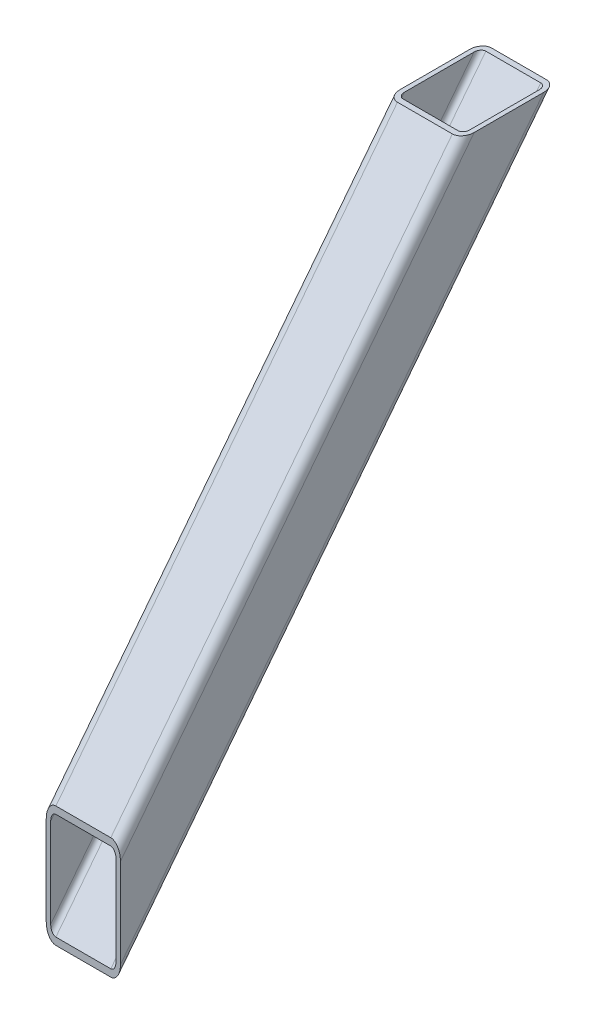
ISO-10303-21;
HEADER;
FILE_DESCRIPTION(('STEP AP214'),'2;1');
FILE_NAME('part.step','',(''),(''),'','','');
FILE_SCHEMA(('AUTOMOTIVE_DESIGN { 1 0 10303 214 1 1 1 1 }'));
ENDSEC;
DATA;
#1=APPLICATION_CONTEXT('core data for automotive mechanical design processes');
#2=APPLICATION_PROTOCOL_DEFINITION('international standard','automotive_design',2000,#1);
#3=PRODUCT_CONTEXT('',#1,'mechanical');
#4=PRODUCT('Part','Part','',(#3));
#5=PRODUCT_RELATED_PRODUCT_CATEGORY('part','',(#4));
#6=PRODUCT_DEFINITION_FORMATION('','',#4);
#7=PRODUCT_DEFINITION_CONTEXT('part definition',#1,'design');
#8=PRODUCT_DEFINITION('design','',#6,#7);
#9=PRODUCT_DEFINITION_SHAPE('','',#8);
#10=(LENGTH_UNIT() NAMED_UNIT(*) SI_UNIT(.MILLI.,.METRE.));
#11=(NAMED_UNIT(*) PLANE_ANGLE_UNIT() SI_UNIT($,.RADIAN.));
#12=(NAMED_UNIT(*) SI_UNIT($,.STERADIAN.) SOLID_ANGLE_UNIT());
#13=UNCERTAINTY_MEASURE_WITH_UNIT(LENGTH_MEASURE(1.E-05),#10,'distance_accuracy_value','');
#14=(GEOMETRIC_REPRESENTATION_CONTEXT(3) GLOBAL_UNCERTAINTY_ASSIGNED_CONTEXT((#13)) GLOBAL_UNIT_ASSIGNED_CONTEXT((#10,
#11,#12)) REPRESENTATION_CONTEXT('',''));
#15=CARTESIAN_POINT('',(0.,0.,0.));
#16=DIRECTION('',(0.,0.,1.));
#17=DIRECTION('',(1.,0.,0.));
#18=AXIS2_PLACEMENT_3D('',#15,#16,#17);
#19=CARTESIAN_POINT('',(22.5000000000001,344.,-266.521245599452));
#20=DIRECTION('',(0.,-1.,0.));
#21=DIRECTION('',(0.,0.,-1.));
#22=AXIS2_PLACEMENT_3D('',#19,#20,#21);
#23=PLANE('',#22);
#24=DIRECTION('',(0.,0.,1.));
#25=VECTOR('',#24,1.);
#26=CARTESIAN_POINT('',(22.,344.,14.597399852797));
#27=LINE('',#26,#25);
#28=CARTESIAN_POINT('',(22.,344.,-291.274527794179));
#29=VERTEX_POINT('',#28);
#30=CARTESIAN_POINT('',(22.,344.,-244.382615062964));
#31=VERTEX_POINT('',#30);
#32=EDGE_CURVE('E183',#29,#31,#27,.T.);
#33=ORIENTED_EDGE('',*,*,#32,.T.);
#34=CARTESIAN_POINT('',(18.5,344.,-244.382615062964));
#35=DIRECTION('',(0.,-1.,0.));
#36=DIRECTION('',(0.,0.,-1.));
#37=AXIS2_PLACEMENT_3D('',#34,#35,#36);
#38=ELLIPSE('',#37,4.43572147457432,3.49999999999998);
#39=CARTESIAN_POINT('',(18.5,344.,-239.94689358839));
#40=VERTEX_POINT('',#39);
#41=EDGE_CURVE('E282',#31,#40,#38,.T.);
#42=ORIENTED_EDGE('',*,*,#41,.T.);
#43=DIRECTION('',(-1.,0.,0.));
#44=VECTOR('',#43,1.);
#45=CARTESIAN_POINT('',(18.5,344.,-239.94689358839));
#46=LINE('',#45,#44);
#47=CARTESIAN_POINT('',(-18.5,344.,-239.94689358839));
#48=VERTEX_POINT('',#47);
#49=EDGE_CURVE('E278',#40,#48,#46,.T.);
#50=ORIENTED_EDGE('',*,*,#49,.T.);
#51=CARTESIAN_POINT('',(-18.5,344.,-244.382615062964));
#52=DIRECTION('',(0.,-1.,0.));
#53=DIRECTION('',(0.,0.,-1.));
#54=AXIS2_PLACEMENT_3D('',#51,#52,#53);
#55=ELLIPSE('',#54,4.43572147457432,3.49999999999998);
#56=CARTESIAN_POINT('',(-22.,344.,-244.382615062964));
#57=VERTEX_POINT('',#56);
#58=EDGE_CURVE('E279',#48,#57,#55,.T.);
#59=ORIENTED_EDGE('',*,*,#58,.T.);
#60=DIRECTION('',(0.,0.,-1.));
#61=VECTOR('',#60,1.);
#62=CARTESIAN_POINT('',(-22.0000000000001,344.,-14.597399852797));
#63=LINE('',#62,#61);
#64=CARTESIAN_POINT('',(-22.,344.,-291.274527794179));
#65=VERTEX_POINT('',#64);
#66=EDGE_CURVE('E185',#57,#65,#63,.T.);
#67=ORIENTED_EDGE('',*,*,#66,.T.);
#68=CARTESIAN_POINT('',(-18.5,344.,-291.274527794179));
#69=DIRECTION('',(0.,-1.,0.));
#70=DIRECTION('',(0.,0.,-1.));
#71=AXIS2_PLACEMENT_3D('',#68,#69,#70);
#72=ELLIPSE('',#71,4.43572147457432,3.49999999999998);
#73=CARTESIAN_POINT('',(-18.5,344.,-295.710249268753));
#74=VERTEX_POINT('',#73);
#75=EDGE_CURVE('E189',#65,#74,#72,.T.);
#76=ORIENTED_EDGE('',*,*,#75,.T.);
#77=DIRECTION('',(1.,0.,0.));
#78=VECTOR('',#77,1.);
#79=CARTESIAN_POINT('',(18.5,344.,-295.710249268753));
#80=LINE('',#79,#78);
#81=CARTESIAN_POINT('',(18.5,344.,-295.710249268753));
#82=VERTEX_POINT('',#81);
#83=EDGE_CURVE('E76',#74,#82,#80,.T.);
#84=ORIENTED_EDGE('',*,*,#83,.T.);
#85=CARTESIAN_POINT('',(18.5,344.,-291.274527794179));
#86=DIRECTION('',(0.,-1.,0.));
#87=DIRECTION('',(0.,0.,-1.));
#88=AXIS2_PLACEMENT_3D('',#85,#86,#87);
#89=ELLIPSE('',#88,4.43572147457432,3.49999999999998);
#90=EDGE_CURVE('E13',#82,#29,#89,.T.);
#91=ORIENTED_EDGE('',*,*,#90,.T.);
#92=EDGE_LOOP('',(#33,#42,#50,#59,#67,#76,#84,#91));
#93=FACE_BOUND('',#92,.T.);
#94=CARTESIAN_POINT('',(18.5000000000001,344.,-244.382615062964));
#95=DIRECTION('',(0.,-1.,0.));
#96=DIRECTION('',(0.,0.,-1.));
#97=AXIS2_PLACEMENT_3D('',#94,#95,#96);
#98=ELLIPSE('',#97,8.23776845278092,6.5);
#99=CARTESIAN_POINT('',(25.0000000000001,344.,-244.382615062964));
#100=VERTEX_POINT('',#99);
#101=CARTESIAN_POINT('',(18.5,344.,-236.144846610183));
#102=VERTEX_POINT('',#101);
#103=EDGE_CURVE('E258',#100,#102,#98,.T.);
#104=ORIENTED_EDGE('',*,*,#103,.F.);
#105=DIRECTION('',(0.,0.,1.));
#106=VECTOR('',#105,1.);
#107=CARTESIAN_POINT('',(25.0000000000001,344.,14.597399852797));
#108=LINE('',#107,#106);
#109=CARTESIAN_POINT('',(25.0000000000001,344.,-291.274527794179));
#110=VERTEX_POINT('',#109);
#111=EDGE_CURVE('E201',#110,#100,#108,.T.);
#112=ORIENTED_EDGE('',*,*,#111,.F.);
#113=CARTESIAN_POINT('',(18.5000000000001,344.,-291.274527794179));
#114=DIRECTION('',(0.,-1.,0.));
#115=DIRECTION('',(0.,0.,-1.));
#116=AXIS2_PLACEMENT_3D('',#113,#114,#115);
#117=ELLIPSE('',#116,8.23776845278092,6.5);
#118=CARTESIAN_POINT('',(18.5,344.,-299.51229624696));
#119=VERTEX_POINT('',#118);
#120=EDGE_CURVE('E199',#119,#110,#117,.T.);
#121=ORIENTED_EDGE('',*,*,#120,.F.);
#122=DIRECTION('',(1.,0.,0.));
#123=VECTOR('',#122,1.);
#124=CARTESIAN_POINT('',(18.5,344.,-299.51229624696));
#125=LINE('',#124,#123);
#126=CARTESIAN_POINT('',(-18.4999999999999,344.,-299.51229624696));
#127=VERTEX_POINT('',#126);
#128=EDGE_CURVE('E195',#127,#119,#125,.T.);
#129=ORIENTED_EDGE('',*,*,#128,.F.);
#130=CARTESIAN_POINT('',(-18.5,344.,-291.274527794179));
#131=DIRECTION('',(0.,-1.,0.));
#132=DIRECTION('',(0.,0.,-1.));
#133=AXIS2_PLACEMENT_3D('',#130,#131,#132);
#134=ELLIPSE('',#133,8.23776845278092,6.5);
#135=CARTESIAN_POINT('',(-25.,344.,-291.274527794179));
#136=VERTEX_POINT('',#135);
#137=EDGE_CURVE('E193',#136,#127,#134,.T.);
#138=ORIENTED_EDGE('',*,*,#137,.F.);
#139=DIRECTION('',(0.,0.,-1.));
#140=VECTOR('',#139,1.);
#141=CARTESIAN_POINT('',(-25.,344.,-14.597399852797));
#142=LINE('',#141,#140);
#143=CARTESIAN_POINT('',(-25.,344.,-244.382615062964));
#144=VERTEX_POINT('',#143);
#145=EDGE_CURVE('E186',#144,#136,#142,.T.);
#146=ORIENTED_EDGE('',*,*,#145,.F.);
#147=CARTESIAN_POINT('',(-18.4999999999999,344.,-244.382615062964));
#148=DIRECTION('',(0.,-1.,0.));
#149=DIRECTION('',(0.,0.,-1.));
#150=AXIS2_PLACEMENT_3D('',#147,#148,#149);
#151=ELLIPSE('',#150,8.23776845278092,6.5);
#152=CARTESIAN_POINT('',(-18.4999999999999,344.,-236.144846610183));
#153=VERTEX_POINT('',#152);
#154=EDGE_CURVE('E275',#153,#144,#151,.T.);
#155=ORIENTED_EDGE('',*,*,#154,.F.);
#156=DIRECTION('',(-1.,0.,0.));
#157=VECTOR('',#156,1.);
#158=CARTESIAN_POINT('',(18.5,344.,-236.144846610183));
#159=LINE('',#158,#157);
#160=EDGE_CURVE('E265',#102,#153,#159,.T.);
#161=ORIENTED_EDGE('',*,*,#160,.F.);
#162=EDGE_LOOP('',(#104,#112,#121,#129,#138,#146,#155,#161));
#163=FACE_BOUND('',#162,.T.);
#164=ADVANCED_FACE('F66',(#93,#163),#23,.F.);
#165=CARTESIAN_POINT('',(-25.,-11.3651184568205,-14.597399852797));
#166=DIRECTION('',(1.,0.,0.));
#167=DIRECTION('',(0.,0.,-1.));
#168=AXIS2_PLACEMENT_3D('',#165,#166,#167);
#169=PLANE('',#168);
#170=DIRECTION('',(0.,0.789048640691729,-0.614330727395703));
#171=VECTOR('',#170,1.);
#172=CARTESIAN_POINT('',(-25.,-11.3651184568205,-14.597399852797));
#173=LINE('',#172,#171);
#174=CARTESIAN_POINT('',(-25.,-22.4076503778441,-6.));
#175=VERTEX_POINT('',#174);
#176=EDGE_CURVE('E85',#175,#136,#173,.T.);
#177=ORIENTED_EDGE('',*,*,#176,.F.);
#178=DIRECTION('',(0.,1.,0.));
#179=VECTOR('',#178,1.);
#180=CARTESIAN_POINT('',(-25.,-11.3651184568205,-6.));
#181=LINE('',#180,#179);
#182=CARTESIAN_POINT('',(-25.,37.8204944145413,-6.));
#183=VERTEX_POINT('',#182);
#184=EDGE_CURVE('E310',#175,#183,#181,.T.);
#185=ORIENTED_EDGE('',*,*,#184,.T.);
#186=DIRECTION('',(0.,0.789048640691729,-0.614330727395703));
#187=VECTOR('',#186,1.);
#188=CARTESIAN_POINT('',(-25.,11.3651184568205,14.597399852797));
#189=LINE('',#188,#187);
#190=EDGE_CURVE('E294',#183,#144,#189,.T.);
#191=ORIENTED_EDGE('',*,*,#190,.T.);
#192=ORIENTED_EDGE('',*,*,#145,.T.);
#193=EDGE_LOOP('',(#177,#185,#191,#192));
#194=FACE_BOUND('',#193,.T.);
#195=ADVANCED_FACE('F222',(#194),#169,.F.);
#196=CARTESIAN_POINT('',(-18.5,-11.3651184568205,-14.597399852797));
#197=DIRECTION('',(0.,0.789048640691729,-0.614330727395703));
#198=DIRECTION('',(0.,0.614330727395704,0.78904864069173));
#199=AXIS2_PLACEMENT_3D('',#196,#197,#198);
#200=CYLINDRICAL_SURFACE('',#199,6.5);
#201=DIRECTION('',(0.,0.789048640691729,-0.614330727395703));
#202=VECTOR('',#201,1.);
#203=CARTESIAN_POINT('',(-18.4999999999999,-15.3582681848926,-19.7262160172932));
#204=LINE('',#203,#202);
#205=CARTESIAN_POINT('',(-18.4999999999999,-32.988270408939,-6.));
#206=VERTEX_POINT('',#205);
#207=EDGE_CURVE('E198',#206,#127,#204,.T.);
#208=ORIENTED_EDGE('',*,*,#207,.F.);
#209=CARTESIAN_POINT('',(-18.5,-22.4076503778442,-6.));
#210=DIRECTION('',(0.,0.,-1.));
#211=DIRECTION('',(0.,1.,0.));
#212=AXIS2_PLACEMENT_3D('',#209,#210,#211);
#213=ELLIPSE('',#212,10.5806200310948,6.5);
#214=EDGE_CURVE('E312',#206,#175,#213,.T.);
#215=ORIENTED_EDGE('',*,*,#214,.T.);
#216=ORIENTED_EDGE('',*,*,#176,.T.);
#217=ORIENTED_EDGE('',*,*,#137,.T.);
#218=EDGE_LOOP('',(#208,#215,#216,#217));
#219=FACE_BOUND('',#218,.T.);
#220=ADVANCED_FACE('F227',(#219),#200,.T.);
#221=CARTESIAN_POINT('',(18.5,-15.3582681848926,-19.7262160172932));
#222=DIRECTION('',(0.,0.614330727395703,0.789048640691729));
#223=DIRECTION('',(0.,-0.78904864069173,0.614330727395704));
#224=AXIS2_PLACEMENT_3D('',#221,#222,#223);
#225=PLANE('',#224);
#226=DIRECTION('',(0.,0.789048640691729,-0.614330727395703));
#227=VECTOR('',#226,1.);
#228=CARTESIAN_POINT('',(18.5,-15.3582681848926,-19.7262160172932));
#229=LINE('',#228,#227);
#230=CARTESIAN_POINT('',(18.5,-32.988270408939,-6.));
#231=VERTEX_POINT('',#230);
#232=EDGE_CURVE('E98',#231,#119,#229,.T.);
#233=ORIENTED_EDGE('',*,*,#232,.F.);
#234=DIRECTION('',(-1.,0.,0.));
#235=VECTOR('',#234,1.);
#236=CARTESIAN_POINT('',(18.5,-32.988270408939,-6.));
#237=LINE('',#236,#235);
#238=EDGE_CURVE('E314',#231,#206,#237,.T.);
#239=ORIENTED_EDGE('',*,*,#238,.T.);
#240=ORIENTED_EDGE('',*,*,#207,.T.);
#241=ORIENTED_EDGE('',*,*,#128,.T.);
#242=EDGE_LOOP('',(#233,#239,#240,#241));
#243=FACE_BOUND('',#242,.T.);
#244=ADVANCED_FACE('F234',(#243),#225,.F.);
#245=CARTESIAN_POINT('',(18.5000000000001,-11.3651184568205,-14.597399852797));
#246=DIRECTION('',(0.,0.789048640691729,-0.614330727395703));
#247=DIRECTION('',(0.,0.614330727395704,0.78904864069173));
#248=AXIS2_PLACEMENT_3D('',#245,#246,#247);
#249=CYLINDRICAL_SURFACE('',#248,6.5);
#250=DIRECTION('',(0.,0.789048640691729,-0.614330727395703));
#251=VECTOR('',#250,1.);
#252=CARTESIAN_POINT('',(25.0000000000001,-11.3651184568205,-14.597399852797));
#253=LINE('',#252,#251);
#254=CARTESIAN_POINT('',(25.0000000000001,-22.4076503778441,-6.));
#255=VERTEX_POINT('',#254);
#256=EDGE_CURVE('E106',#255,#110,#253,.T.);
#257=ORIENTED_EDGE('',*,*,#256,.F.);
#258=CARTESIAN_POINT('',(18.5000000000001,-22.4076503778442,-6.));
#259=DIRECTION('',(0.,0.,-1.));
#260=DIRECTION('',(0.,1.,0.));
#261=AXIS2_PLACEMENT_3D('',#258,#259,#260);
#262=ELLIPSE('',#261,10.5806200310948,6.5);
#263=EDGE_CURVE('E317',#255,#231,#262,.T.);
#264=ORIENTED_EDGE('',*,*,#263,.T.);
#265=ORIENTED_EDGE('',*,*,#232,.T.);
#266=ORIENTED_EDGE('',*,*,#120,.T.);
#267=EDGE_LOOP('',(#257,#264,#265,#266));
#268=FACE_BOUND('',#267,.T.);
#269=ADVANCED_FACE('F237',(#268),#249,.T.);
#270=CARTESIAN_POINT('',(25.0000000000001,11.3651184568205,14.597399852797));
#271=DIRECTION('',(-1.,0.,0.));
#272=DIRECTION('',(0.,0.,1.));
#273=AXIS2_PLACEMENT_3D('',#270,#271,#272);
#274=PLANE('',#273);
#275=ORIENTED_EDGE('',*,*,#111,.T.);
#276=DIRECTION('',(0.,0.789048640691729,-0.614330727395703));
#277=VECTOR('',#276,1.);
#278=CARTESIAN_POINT('',(25.0000000000001,11.3651184568205,14.597399852797));
#279=LINE('',#278,#277);
#280=CARTESIAN_POINT('',(25.0000000000001,37.8204944145413,-6.));
#281=VERTEX_POINT('',#280);
#282=EDGE_CURVE('E248',#281,#100,#279,.T.);
#283=ORIENTED_EDGE('',*,*,#282,.F.);
#284=DIRECTION('',(0.,-1.,0.));
#285=VECTOR('',#284,1.);
#286=CARTESIAN_POINT('',(25.0000000000001,11.3651184568205,-6.));
#287=LINE('',#286,#285);
#288=EDGE_CURVE('E179',#281,#255,#287,.T.);
#289=ORIENTED_EDGE('',*,*,#288,.T.);
#290=ORIENTED_EDGE('',*,*,#256,.T.);
#291=EDGE_LOOP('',(#275,#283,#289,#290));
#292=FACE_BOUND('',#291,.T.);
#293=ADVANCED_FACE('F219',(#292),#274,.F.);
#294=CARTESIAN_POINT('',(22.,11.3651184568205,14.597399852797));
#295=DIRECTION('',(-1.,0.,0.));
#296=DIRECTION('',(0.,0.,1.));
#297=AXIS2_PLACEMENT_3D('',#294,#295,#296);
#298=PLANE('',#297);
#299=DIRECTION('',(0.,0.789048640691729,-0.614330727395703));
#300=VECTOR('',#299,1.);
#301=CARTESIAN_POINT('',(22.,-11.3651184568205,-14.597399852797));
#302=LINE('',#301,#300);
#303=CARTESIAN_POINT('',(22.,-22.4076503778441,-6.));
#304=VERTEX_POINT('',#303);
#305=EDGE_CURVE('E115',#304,#29,#302,.T.);
#306=ORIENTED_EDGE('',*,*,#305,.F.);
#307=DIRECTION('',(0.,-1.,0.));
#308=VECTOR('',#307,1.);
#309=CARTESIAN_POINT('',(22.,11.3651184568205,-6.));
#310=LINE('',#309,#308);
#311=CARTESIAN_POINT('',(22.,37.8204944145413,-6.));
#312=VERTEX_POINT('',#311);
#313=EDGE_CURVE('E320',#312,#304,#310,.T.);
#314=ORIENTED_EDGE('',*,*,#313,.F.);
#315=DIRECTION('',(0.,0.789048640691729,-0.614330727395703));
#316=VECTOR('',#315,1.);
#317=CARTESIAN_POINT('',(22.,11.3651184568205,14.597399852797));
#318=LINE('',#317,#316);
#319=EDGE_CURVE('E298',#312,#31,#318,.T.);
#320=ORIENTED_EDGE('',*,*,#319,.T.);
#321=ORIENTED_EDGE('',*,*,#32,.F.);
#322=EDGE_LOOP('',(#306,#314,#320,#321));
#323=FACE_BOUND('',#322,.T.);
#324=ADVANCED_FACE('F212',(#323),#298,.T.);
#325=CARTESIAN_POINT('',(18.5,-11.3651184568205,-14.597399852797));
#326=DIRECTION('',(0.,0.789048640691729,-0.614330727395703));
#327=DIRECTION('',(0.,0.614330727395704,0.78904864069173));
#328=AXIS2_PLACEMENT_3D('',#325,#326,#327);
#329=CYLINDRICAL_SURFACE('',#328,3.49999999999998);
#330=DIRECTION('',(0.,0.789048640691729,-0.614330727395703));
#331=VECTOR('',#330,1.);
#332=CARTESIAN_POINT('',(18.5,-13.5152760027055,-17.359070095218));
#333=LINE('',#332,#331);
#334=CARTESIAN_POINT('',(18.5,-28.1049073176644,-6.));
#335=VERTEX_POINT('',#334);
#336=EDGE_CURVE('E160',#335,#82,#333,.T.);
#337=ORIENTED_EDGE('',*,*,#336,.F.);
#338=CARTESIAN_POINT('',(18.5,-22.4076503778442,-6.));
#339=DIRECTION('',(0.,0.,-1.));
#340=DIRECTION('',(0.,1.,0.));
#341=AXIS2_PLACEMENT_3D('',#338,#339,#340);
#342=ELLIPSE('',#341,5.69725693982023,3.49999999999998);
#343=EDGE_CURVE('E174',#304,#335,#342,.T.);
#344=ORIENTED_EDGE('',*,*,#343,.F.);
#345=ORIENTED_EDGE('',*,*,#305,.T.);
#346=ORIENTED_EDGE('',*,*,#90,.F.);
#347=EDGE_LOOP('',(#337,#344,#345,#346));
#348=FACE_BOUND('',#347,.T.);
#349=ADVANCED_FACE('F210',(#348),#329,.F.);
#350=CARTESIAN_POINT('',(18.5,-13.5152760027055,-17.359070095218));
#351=DIRECTION('',(0.,0.614330727395703,0.789048640691729));
#352=DIRECTION('',(0.,-0.78904864069173,0.614330727395704));
#353=AXIS2_PLACEMENT_3D('',#350,#351,#352);
#354=PLANE('',#353);
#355=DIRECTION('',(0.,0.789048640691729,-0.614330727395703));
#356=VECTOR('',#355,1.);
#357=CARTESIAN_POINT('',(-18.5,-13.5152760027055,-17.359070095218));
#358=LINE('',#357,#356);
#359=CARTESIAN_POINT('',(-18.5,-28.1049073176644,-6.));
#360=VERTEX_POINT('',#359);
#361=EDGE_CURVE('E127',#360,#74,#358,.T.);
#362=ORIENTED_EDGE('',*,*,#361,.F.);
#363=DIRECTION('',(-1.,0.,0.));
#364=VECTOR('',#363,1.);
#365=CARTESIAN_POINT('',(18.5,-28.1049073176644,-6.));
#366=LINE('',#365,#364);
#367=EDGE_CURVE('E167',#335,#360,#366,.T.);
#368=ORIENTED_EDGE('',*,*,#367,.F.);
#369=ORIENTED_EDGE('',*,*,#336,.T.);
#370=ORIENTED_EDGE('',*,*,#83,.F.);
#371=EDGE_LOOP('',(#362,#368,#369,#370));
#372=FACE_BOUND('',#371,.T.);
#373=ADVANCED_FACE('F166',(#372),#354,.T.);
#374=CARTESIAN_POINT('',(-18.5,-11.3651184568205,-14.597399852797));
#375=DIRECTION('',(0.,0.789048640691729,-0.614330727395703));
#376=DIRECTION('',(0.,0.614330727395704,0.78904864069173));
#377=AXIS2_PLACEMENT_3D('',#374,#375,#376);
#378=CYLINDRICAL_SURFACE('',#377,3.49999999999998);
#379=DIRECTION('',(0.,0.789048640691729,-0.614330727395703));
#380=VECTOR('',#379,1.);
#381=CARTESIAN_POINT('',(-22.,-11.3651184568205,-14.597399852797));
#382=LINE('',#381,#380);
#383=CARTESIAN_POINT('',(-22.,-22.4076503778441,-6.));
#384=VERTEX_POINT('',#383);
#385=EDGE_CURVE('E70',#384,#65,#382,.T.);
#386=ORIENTED_EDGE('',*,*,#385,.F.);
#387=CARTESIAN_POINT('',(-18.5,-22.4076503778442,-6.));
#388=DIRECTION('',(0.,0.,-1.));
#389=DIRECTION('',(0.,1.,0.));
#390=AXIS2_PLACEMENT_3D('',#387,#388,#389);
#391=ELLIPSE('',#390,5.69725693982023,3.49999999999998);
#392=EDGE_CURVE('E173',#360,#384,#391,.T.);
#393=ORIENTED_EDGE('',*,*,#392,.F.);
#394=ORIENTED_EDGE('',*,*,#361,.T.);
#395=ORIENTED_EDGE('',*,*,#75,.F.);
#396=EDGE_LOOP('',(#386,#393,#394,#395));
#397=FACE_BOUND('',#396,.T.);
#398=ADVANCED_FACE('F176',(#397),#378,.F.);
#399=CARTESIAN_POINT('',(-22.,-11.3651184568205,-14.597399852797));
#400=DIRECTION('',(1.,0.,0.));
#401=DIRECTION('',(0.,0.,-1.));
#402=AXIS2_PLACEMENT_3D('',#399,#400,#401);
#403=PLANE('',#402);
#404=ORIENTED_EDGE('',*,*,#66,.F.);
#405=DIRECTION('',(0.,0.789048640691729,-0.614330727395703));
#406=VECTOR('',#405,1.);
#407=CARTESIAN_POINT('',(-22.,11.3651184568205,14.597399852797));
#408=LINE('',#407,#406);
#409=CARTESIAN_POINT('',(-22.,37.8204944145413,-6.));
#410=VERTEX_POINT('',#409);
#411=EDGE_CURVE('E299',#410,#57,#408,.T.);
#412=ORIENTED_EDGE('',*,*,#411,.F.);
#413=DIRECTION('',(0.,1.,0.));
#414=VECTOR('',#413,1.);
#415=CARTESIAN_POINT('',(-22.,-11.3651184568205,-6.));
#416=LINE('',#415,#414);
#417=EDGE_CURVE('E177',#384,#410,#416,.T.);
#418=ORIENTED_EDGE('',*,*,#417,.F.);
#419=ORIENTED_EDGE('',*,*,#385,.T.);
#420=EDGE_LOOP('',(#404,#412,#418,#419));
#421=FACE_BOUND('',#420,.T.);
#422=ADVANCED_FACE('F68',(#421),#403,.T.);
#423=CARTESIAN_POINT('',(0.,0.,-6.));
#424=DIRECTION('',(0.,0.,-1.));
#425=DIRECTION('',(-1.,0.,0.));
#426=AXIS2_PLACEMENT_3D('',#423,#424,#425);
#427=PLANE('',#426);
#428=CARTESIAN_POINT('',(-18.4999999999999,37.8204944145415,-6.));
#429=DIRECTION('',(0.,0.,-1.));
#430=DIRECTION('',(0.,1.,0.));
#431=AXIS2_PLACEMENT_3D('',#428,#429,#430);
#432=ELLIPSE('',#431,10.5806200310948,6.5);
#433=CARTESIAN_POINT('',(-18.4999999999999,48.4011144456362,-6.));
#434=VERTEX_POINT('',#433);
#435=EDGE_CURVE('E266',#183,#434,#432,.T.);
#436=ORIENTED_EDGE('',*,*,#435,.F.);
#437=ORIENTED_EDGE('',*,*,#184,.F.);
#438=ORIENTED_EDGE('',*,*,#214,.F.);
#439=ORIENTED_EDGE('',*,*,#238,.F.);
#440=ORIENTED_EDGE('',*,*,#263,.F.);
#441=ORIENTED_EDGE('',*,*,#288,.F.);
#442=CARTESIAN_POINT('',(18.5000000000001,37.8204944145415,-6.));
#443=DIRECTION('',(0.,0.,-1.));
#444=DIRECTION('',(0.,1.,0.));
#445=AXIS2_PLACEMENT_3D('',#442,#443,#444);
#446=ELLIPSE('',#445,10.5806200310948,6.5);
#447=CARTESIAN_POINT('',(18.5,48.4011144456362,-6.));
#448=VERTEX_POINT('',#447);
#449=EDGE_CURVE('E260',#448,#281,#446,.T.);
#450=ORIENTED_EDGE('',*,*,#449,.F.);
#451=DIRECTION('',(1.,0.,0.));
#452=VECTOR('',#451,1.);
#453=CARTESIAN_POINT('',(18.5,48.4011144456362,-6.));
#454=LINE('',#453,#452);
#455=EDGE_CURVE('E292',#434,#448,#454,.T.);
#456=ORIENTED_EDGE('',*,*,#455,.F.);
#457=EDGE_LOOP('',(#436,#437,#438,#439,#440,#441,#450,#456));
#458=FACE_BOUND('',#457,.T.);
#459=ORIENTED_EDGE('',*,*,#392,.T.);
#460=ORIENTED_EDGE('',*,*,#417,.T.);
#461=CARTESIAN_POINT('',(-18.5,37.8204944145415,-6.));
#462=DIRECTION('',(0.,0.,-1.));
#463=DIRECTION('',(0.,1.,0.));
#464=AXIS2_PLACEMENT_3D('',#461,#462,#463);
#465=ELLIPSE('',#464,5.69725693982023,3.49999999999998);
#466=CARTESIAN_POINT('',(-18.5,43.5177513543617,-6.));
#467=VERTEX_POINT('',#466);
#468=EDGE_CURVE('E285',#410,#467,#465,.T.);
#469=ORIENTED_EDGE('',*,*,#468,.T.);
#470=DIRECTION('',(1.,0.,0.));
#471=VECTOR('',#470,1.);
#472=CARTESIAN_POINT('',(18.5,43.5177513543617,-6.));
#473=LINE('',#472,#471);
#474=CARTESIAN_POINT('',(18.5,43.5177513543617,-6.));
#475=VERTEX_POINT('',#474);
#476=EDGE_CURVE('E322',#467,#475,#473,.T.);
#477=ORIENTED_EDGE('',*,*,#476,.T.);
#478=CARTESIAN_POINT('',(18.5,37.8204944145415,-6.));
#479=DIRECTION('',(0.,0.,-1.));
#480=DIRECTION('',(0.,1.,0.));
#481=AXIS2_PLACEMENT_3D('',#478,#479,#480);
#482=ELLIPSE('',#481,5.69725693982023,3.49999999999998);
#483=EDGE_CURVE('E273',#475,#312,#482,.T.);
#484=ORIENTED_EDGE('',*,*,#483,.T.);
#485=ORIENTED_EDGE('',*,*,#313,.T.);
#486=ORIENTED_EDGE('',*,*,#343,.T.);
#487=ORIENTED_EDGE('',*,*,#367,.T.);
#488=EDGE_LOOP('',(#459,#460,#469,#477,#484,#485,#486,#487));
#489=FACE_BOUND('',#488,.T.);
#490=ADVANCED_FACE('F171',(#458,#489),#427,.F.);
#491=CARTESIAN_POINT('',(18.5,11.3651184568205,14.597399852797));
#492=DIRECTION('',(0.,0.789048640691729,-0.614330727395703));
#493=DIRECTION('',(0.,0.614330727395704,0.78904864069173));
#494=AXIS2_PLACEMENT_3D('',#491,#492,#493);
#495=CYLINDRICAL_SURFACE('',#494,3.49999999999998);
#496=ORIENTED_EDGE('',*,*,#483,.F.);
#497=DIRECTION('',(0.,0.789048640691729,-0.614330727395703));
#498=VECTOR('',#497,1.);
#499=CARTESIAN_POINT('',(18.5,13.5152760027055,17.359070095218));
#500=LINE('',#499,#498);
#501=EDGE_CURVE('E297',#475,#40,#500,.T.);
#502=ORIENTED_EDGE('',*,*,#501,.T.);
#503=ORIENTED_EDGE('',*,*,#41,.F.);
#504=ORIENTED_EDGE('',*,*,#319,.F.);
#505=EDGE_LOOP('',(#496,#502,#503,#504));
#506=FACE_BOUND('',#505,.T.);
#507=ADVANCED_FACE('F359',(#506),#495,.F.);
#508=CARTESIAN_POINT('',(18.5,13.5152760027055,17.359070095218));
#509=DIRECTION('',(0.,-0.614330727395703,-0.789048640691729));
#510=DIRECTION('',(0.,0.78904864069173,-0.614330727395704));
#511=AXIS2_PLACEMENT_3D('',#508,#509,#510);
#512=PLANE('',#511);
#513=ORIENTED_EDGE('',*,*,#476,.F.);
#514=DIRECTION('',(0.,0.789048640691729,-0.614330727395703));
#515=VECTOR('',#514,1.);
#516=CARTESIAN_POINT('',(-18.5,13.5152760027055,17.359070095218));
#517=LINE('',#516,#515);
#518=EDGE_CURVE('E302',#467,#48,#517,.T.);
#519=ORIENTED_EDGE('',*,*,#518,.T.);
#520=ORIENTED_EDGE('',*,*,#49,.F.);
#521=ORIENTED_EDGE('',*,*,#501,.F.);
#522=EDGE_LOOP('',(#513,#519,#520,#521));
#523=FACE_BOUND('',#522,.T.);
#524=ADVANCED_FACE('F367',(#523),#512,.T.);
#525=CARTESIAN_POINT('',(-18.5,11.3651184568205,14.597399852797));
#526=DIRECTION('',(0.,0.789048640691729,-0.614330727395703));
#527=DIRECTION('',(0.,0.614330727395704,0.78904864069173));
#528=AXIS2_PLACEMENT_3D('',#525,#526,#527);
#529=CYLINDRICAL_SURFACE('',#528,3.49999999999998);
#530=ORIENTED_EDGE('',*,*,#468,.F.);
#531=ORIENTED_EDGE('',*,*,#411,.T.);
#532=ORIENTED_EDGE('',*,*,#58,.F.);
#533=ORIENTED_EDGE('',*,*,#518,.F.);
#534=EDGE_LOOP('',(#530,#531,#532,#533));
#535=FACE_BOUND('',#534,.T.);
#536=ADVANCED_FACE('F372',(#535),#529,.F.);
#537=CARTESIAN_POINT('',(18.5,15.3582681848926,19.7262160172932));
#538=DIRECTION('',(0.,-0.614330727395703,-0.789048640691729));
#539=DIRECTION('',(0.,0.78904864069173,-0.614330727395704));
#540=AXIS2_PLACEMENT_3D('',#537,#538,#539);
#541=PLANE('',#540);
#542=DIRECTION('',(0.,0.789048640691729,-0.614330727395703));
#543=VECTOR('',#542,1.);
#544=CARTESIAN_POINT('',(-18.4999999999999,15.3582681848926,19.7262160172932));
#545=LINE('',#544,#543);
#546=EDGE_CURVE('E269',#434,#153,#545,.T.);
#547=ORIENTED_EDGE('',*,*,#546,.F.);
#548=ORIENTED_EDGE('',*,*,#455,.T.);
#549=DIRECTION('',(0.,0.789048640691729,-0.614330727395703));
#550=VECTOR('',#549,1.);
#551=CARTESIAN_POINT('',(18.5,15.3582681848926,19.7262160172932));
#552=LINE('',#551,#550);
#553=EDGE_CURVE('E290',#448,#102,#552,.T.);
#554=ORIENTED_EDGE('',*,*,#553,.T.);
#555=ORIENTED_EDGE('',*,*,#160,.T.);
#556=EDGE_LOOP('',(#547,#548,#554,#555));
#557=FACE_BOUND('',#556,.T.);
#558=ADVANCED_FACE('F338',(#557),#541,.F.);
#559=CARTESIAN_POINT('',(18.5000000000001,11.3651184568205,14.597399852797));
#560=DIRECTION('',(0.,0.789048640691729,-0.614330727395703));
#561=DIRECTION('',(0.,0.614330727395704,0.78904864069173));
#562=AXIS2_PLACEMENT_3D('',#559,#560,#561);
#563=CYLINDRICAL_SURFACE('',#562,6.5);
#564=ORIENTED_EDGE('',*,*,#553,.F.);
#565=ORIENTED_EDGE('',*,*,#449,.T.);
#566=ORIENTED_EDGE('',*,*,#282,.T.);
#567=ORIENTED_EDGE('',*,*,#103,.T.);
#568=EDGE_LOOP('',(#564,#565,#566,#567));
#569=FACE_BOUND('',#568,.T.);
#570=ADVANCED_FACE('F257',(#569),#563,.T.);
#571=CARTESIAN_POINT('',(-18.4999999999999,11.3651184568205,14.597399852797));
#572=DIRECTION('',(0.,0.789048640691729,-0.614330727395703));
#573=DIRECTION('',(0.,0.614330727395704,0.78904864069173));
#574=AXIS2_PLACEMENT_3D('',#571,#572,#573);
#575=CYLINDRICAL_SURFACE('',#574,6.5);
#576=ORIENTED_EDGE('',*,*,#190,.F.);
#577=ORIENTED_EDGE('',*,*,#435,.T.);
#578=ORIENTED_EDGE('',*,*,#546,.T.);
#579=ORIENTED_EDGE('',*,*,#154,.T.);
#580=EDGE_LOOP('',(#576,#577,#578,#579));
#581=FACE_BOUND('',#580,.T.);
#582=ADVANCED_FACE('F380',(#581),#575,.T.);
#583=CLOSED_SHELL('',(#164,#195,#220,#244,#269,#293,#324,#349,#373,#398,#422,#490,#507,#524,
#536,#558,#570,#582));
#584=MANIFOLD_SOLID_BREP('B2',#583);
#585=ADVANCED_BREP_SHAPE_REPRESENTATION('',(#18,#584),#14);
#586=SHAPE_DEFINITION_REPRESENTATION(#9,#585);
ENDSEC;
END-ISO-10303-21;
